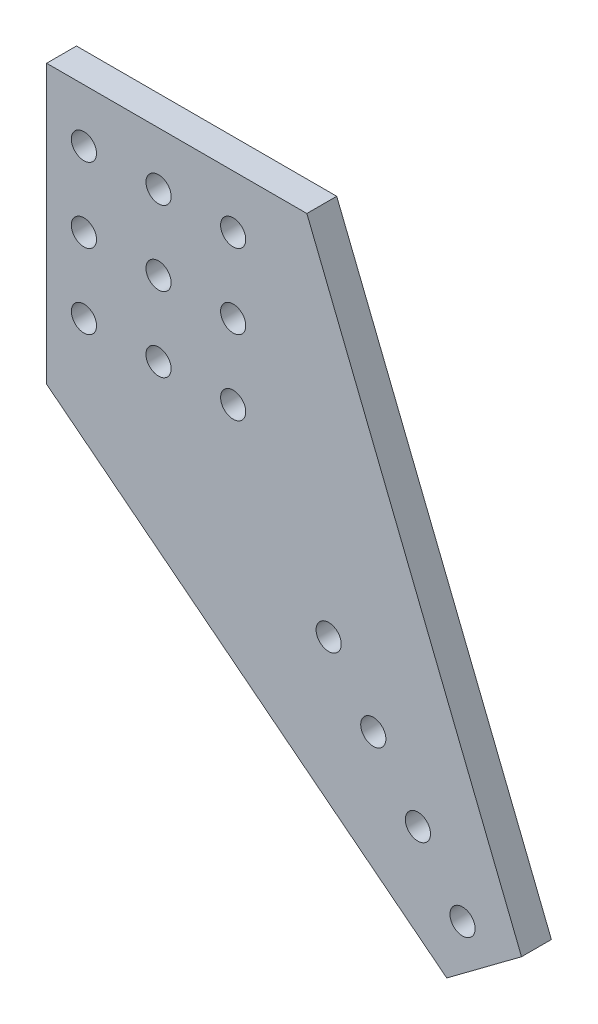
ISO-10303-21;
HEADER;
FILE_DESCRIPTION(('STEP AP214'),'2;1');
FILE_NAME('part.step','',(''),(''),'','','');
FILE_SCHEMA(('AUTOMOTIVE_DESIGN { 1 0 10303 214 1 1 1 1 }'));
ENDSEC;
DATA;
#1=APPLICATION_CONTEXT('core data for automotive mechanical design processes');
#2=APPLICATION_PROTOCOL_DEFINITION('international standard','automotive_design',2000,#1);
#3=PRODUCT_CONTEXT('',#1,'mechanical');
#4=PRODUCT('Part','Part','',(#3));
#5=PRODUCT_RELATED_PRODUCT_CATEGORY('part','',(#4));
#6=PRODUCT_DEFINITION_FORMATION('','',#4);
#7=PRODUCT_DEFINITION_CONTEXT('part definition',#1,'design');
#8=PRODUCT_DEFINITION('design','',#6,#7);
#9=PRODUCT_DEFINITION_SHAPE('','',#8);
#10=(LENGTH_UNIT() NAMED_UNIT(*) SI_UNIT(.MILLI.,.METRE.));
#11=(NAMED_UNIT(*) PLANE_ANGLE_UNIT() SI_UNIT($,.RADIAN.));
#12=(NAMED_UNIT(*) SI_UNIT($,.STERADIAN.) SOLID_ANGLE_UNIT());
#13=UNCERTAINTY_MEASURE_WITH_UNIT(LENGTH_MEASURE(1.E-05),#10,'distance_accuracy_value','');
#14=(GEOMETRIC_REPRESENTATION_CONTEXT(3) GLOBAL_UNCERTAINTY_ASSIGNED_CONTEXT((#13)) GLOBAL_UNIT_ASSIGNED_CONTEXT((#10,
#11,#12)) REPRESENTATION_CONTEXT('',''));
#15=CARTESIAN_POINT('',(0.,0.,0.));
#16=DIRECTION('',(0.,0.,1.));
#17=DIRECTION('',(1.,0.,0.));
#18=AXIS2_PLACEMENT_3D('',#15,#16,#17);
#19=CARTESIAN_POINT('',(0.,0.,-32.));
#20=DIRECTION('',(0.,0.,1.));
#21=DIRECTION('',(1.,0.,0.));
#22=AXIS2_PLACEMENT_3D('',#19,#20,#21);
#23=PLANE('',#22);
#24=CARTESIAN_POINT('',(0.,-80.,-32.));
#25=DIRECTION('',(0.,0.,-1.));
#26=DIRECTION('',(-1.,0.,0.));
#27=AXIS2_PLACEMENT_3D('',#24,#25,#26);
#28=CIRCLE('',#27,13.5);
#29=CARTESIAN_POINT('',(-13.5,-80.,-32.));
#30=VERTEX_POINT('',#29);
#31=EDGE_CURVE('E208',#30,#30,#28,.T.);
#32=ORIENTED_EDGE('',*,*,#31,.F.);
#33=EDGE_LOOP('',(#32));
#34=FACE_BOUND('',#33,.T.);
#35=CARTESIAN_POINT('',(80.,80.,-32.));
#36=DIRECTION('',(0.,0.,-1.));
#37=DIRECTION('',(-1.,0.,0.));
#38=AXIS2_PLACEMENT_3D('',#35,#36,#37);
#39=CIRCLE('',#38,13.5);
#40=CARTESIAN_POINT('',(66.5,80.,-32.));
#41=VERTEX_POINT('',#40);
#42=EDGE_CURVE('E220',#41,#41,#39,.T.);
#43=ORIENTED_EDGE('',*,*,#42,.F.);
#44=EDGE_LOOP('',(#43));
#45=FACE_BOUND('',#44,.T.);
#46=CARTESIAN_POINT('',(-80.,80.,-32.));
#47=DIRECTION('',(0.,0.,-1.));
#48=DIRECTION('',(-1.,0.,0.));
#49=AXIS2_PLACEMENT_3D('',#46,#47,#48);
#50=CIRCLE('',#49,13.5);
#51=CARTESIAN_POINT('',(-93.5,80.,-32.));
#52=VERTEX_POINT('',#51);
#53=EDGE_CURVE('E232',#52,#52,#50,.T.);
#54=ORIENTED_EDGE('',*,*,#53,.F.);
#55=EDGE_LOOP('',(#54));
#56=FACE_BOUND('',#55,.T.);
#57=CARTESIAN_POINT('',(-80.,0.,-32.));
#58=DIRECTION('',(0.,0.,-1.));
#59=DIRECTION('',(-1.,0.,0.));
#60=AXIS2_PLACEMENT_3D('',#57,#58,#59);
#61=CIRCLE('',#60,13.5);
#62=CARTESIAN_POINT('',(-93.5,0.,-32.));
#63=VERTEX_POINT('',#62);
#64=EDGE_CURVE('E244',#63,#63,#61,.T.);
#65=ORIENTED_EDGE('',*,*,#64,.F.);
#66=EDGE_LOOP('',(#65));
#67=FACE_BOUND('',#66,.T.);
#68=CARTESIAN_POINT('',(278.044933423364,-372.714387966976,-32.));
#69=DIRECTION('',(0.,0.,-1.));
#70=DIRECTION('',(-1.,0.,0.));
#71=AXIS2_PLACEMENT_3D('',#68,#69,#70);
#72=CIRCLE('',#71,13.5);
#73=CARTESIAN_POINT('',(264.544933423364,-372.714387966976,-32.));
#74=VERTEX_POINT('',#73);
#75=EDGE_CURVE('E256',#74,#74,#72,.T.);
#76=ORIENTED_EDGE('',*,*,#75,.F.);
#77=EDGE_LOOP('',(#76));
#78=FACE_BOUND('',#77,.T.);
#79=CARTESIAN_POINT('',(182.373558481991,-244.468577053608,-32.));
#80=DIRECTION('',(0.,0.,-1.));
#81=DIRECTION('',(-1.,0.,0.));
#82=AXIS2_PLACEMENT_3D('',#79,#80,#81);
#83=CIRCLE('',#82,13.5);
#84=CARTESIAN_POINT('',(168.873558481991,-244.468577053608,-32.));
#85=VERTEX_POINT('',#84);
#86=EDGE_CURVE('E268',#85,#85,#83,.T.);
#87=ORIENTED_EDGE('',*,*,#86,.F.);
#88=EDGE_LOOP('',(#87));
#89=FACE_BOUND('',#88,.T.);
#90=DIRECTION('',(-0.786547065545626,0.617530334219757,0.));
#91=VECTOR('',#90,1.);
#92=CARTESIAN_POINT('',(-120.,-161.,-32.));
#93=LINE('',#92,#91);
#94=CARTESIAN_POINT('',(308.97457337278,-497.794609338358,-32.));
#95=VERTEX_POINT('',#94);
#96=CARTESIAN_POINT('',(-120.,-161.,-32.));
#97=VERTEX_POINT('',#96);
#98=EDGE_CURVE('E116',#95,#97,#93,.T.);
#99=ORIENTED_EDGE('',*,*,#98,.T.);
#100=DIRECTION('',(0.,1.,0.));
#101=VECTOR('',#100,1.);
#102=CARTESIAN_POINT('',(-120.,-161.,-32.));
#103=LINE('',#102,#101);
#104=CARTESIAN_POINT('',(-120.,137.,-32.));
#105=VERTEX_POINT('',#104);
#106=EDGE_CURVE('E83',#97,#105,#103,.T.);
#107=ORIENTED_EDGE('',*,*,#106,.T.);
#108=DIRECTION('',(1.,0.,0.));
#109=VECTOR('',#108,1.);
#110=CARTESIAN_POINT('',(-120.,137.,-32.));
#111=LINE('',#110,#109);
#112=CARTESIAN_POINT('',(159.,137.,-32.));
#113=VERTEX_POINT('',#112);
#114=EDGE_CURVE('E87',#105,#113,#111,.T.);
#115=ORIENTED_EDGE('',*,*,#114,.T.);
#116=DIRECTION('',(0.371569119840066,-0.928405293598264,0.));
#117=VECTOR('',#116,1.);
#118=CARTESIAN_POINT('',(159.,137.,-32.));
#119=LINE('',#118,#117);
#120=CARTESIAN_POINT('',(389.128205193635,-438.,-32.));
#121=VERTEX_POINT('',#120);
#122=EDGE_CURVE('E91',#113,#121,#119,.T.);
#123=ORIENTED_EDGE('',*,*,#122,.T.);
#124=DIRECTION('',(-0.80153631820855,-0.597946093383577,0.));
#125=VECTOR('',#124,1.);
#126=CARTESIAN_POINT('',(308.97457337278,-497.794609338358,-32.));
#127=LINE('',#126,#125);
#128=EDGE_CURVE('E49',#121,#95,#127,.T.);
#129=ORIENTED_EDGE('',*,*,#128,.T.);
#130=EDGE_LOOP('',(#99,#107,#115,#123,#129));
#131=FACE_BOUND('',#130,.T.);
#132=CARTESIAN_POINT('',(0.,0.,-32.));
#133=DIRECTION('',(0.,0.,-1.));
#134=DIRECTION('',(-1.,0.,0.));
#135=AXIS2_PLACEMENT_3D('',#132,#133,#134);
#136=CIRCLE('',#135,13.5);
#137=CARTESIAN_POINT('',(-13.5,0.,-32.));
#138=VERTEX_POINT('',#137);
#139=EDGE_CURVE('E111',#138,#138,#136,.T.);
#140=ORIENTED_EDGE('',*,*,#139,.F.);
#141=EDGE_LOOP('',(#140));
#142=FACE_BOUND('',#141,.T.);
#143=CARTESIAN_POINT('',(230.209245952678,-308.591482510292,-32.));
#144=DIRECTION('',(0.,0.,-1.));
#145=DIRECTION('',(-1.,0.,0.));
#146=AXIS2_PLACEMENT_3D('',#143,#144,#145);
#147=CIRCLE('',#146,13.5);
#148=CARTESIAN_POINT('',(216.709245952678,-308.591482510292,-32.));
#149=VERTEX_POINT('',#148);
#150=EDGE_CURVE('E262',#149,#149,#147,.T.);
#151=ORIENTED_EDGE('',*,*,#150,.F.);
#152=EDGE_LOOP('',(#151));
#153=FACE_BOUND('',#152,.T.);
#154=CARTESIAN_POINT('',(325.88062089405,-436.83729342366,-32.));
#155=DIRECTION('',(0.,0.,-1.));
#156=DIRECTION('',(-1.,0.,0.));
#157=AXIS2_PLACEMENT_3D('',#154,#155,#156);
#158=CIRCLE('',#157,13.5);
#159=CARTESIAN_POINT('',(312.38062089405,-436.83729342366,-32.));
#160=VERTEX_POINT('',#159);
#161=EDGE_CURVE('E250',#160,#160,#158,.T.);
#162=ORIENTED_EDGE('',*,*,#161,.F.);
#163=EDGE_LOOP('',(#162));
#164=FACE_BOUND('',#163,.T.);
#165=CARTESIAN_POINT('',(80.,0.,-32.));
#166=DIRECTION('',(0.,0.,-1.));
#167=DIRECTION('',(-1.,0.,0.));
#168=AXIS2_PLACEMENT_3D('',#165,#166,#167);
#169=CIRCLE('',#168,13.5);
#170=CARTESIAN_POINT('',(66.5,0.,-32.));
#171=VERTEX_POINT('',#170);
#172=EDGE_CURVE('E238',#171,#171,#169,.T.);
#173=ORIENTED_EDGE('',*,*,#172,.F.);
#174=EDGE_LOOP('',(#173));
#175=FACE_BOUND('',#174,.T.);
#176=CARTESIAN_POINT('',(0.,80.,-32.));
#177=DIRECTION('',(0.,0.,-1.));
#178=DIRECTION('',(-1.,0.,0.));
#179=AXIS2_PLACEMENT_3D('',#176,#177,#178);
#180=CIRCLE('',#179,13.5);
#181=CARTESIAN_POINT('',(-13.5,80.,-32.));
#182=VERTEX_POINT('',#181);
#183=EDGE_CURVE('E226',#182,#182,#180,.T.);
#184=ORIENTED_EDGE('',*,*,#183,.F.);
#185=EDGE_LOOP('',(#184));
#186=FACE_BOUND('',#185,.T.);
#187=CARTESIAN_POINT('',(-80.,-80.,-32.));
#188=DIRECTION('',(0.,0.,-1.));
#189=DIRECTION('',(-1.,0.,0.));
#190=AXIS2_PLACEMENT_3D('',#187,#188,#189);
#191=CIRCLE('',#190,13.5);
#192=CARTESIAN_POINT('',(-93.5,-80.,-32.));
#193=VERTEX_POINT('',#192);
#194=EDGE_CURVE('E214',#193,#193,#191,.T.);
#195=ORIENTED_EDGE('',*,*,#194,.F.);
#196=EDGE_LOOP('',(#195));
#197=FACE_BOUND('',#196,.T.);
#198=CARTESIAN_POINT('',(80.,-80.,-32.));
#199=DIRECTION('',(0.,0.,-1.));
#200=DIRECTION('',(-1.,0.,0.));
#201=AXIS2_PLACEMENT_3D('',#198,#199,#200);
#202=CIRCLE('',#201,13.5);
#203=CARTESIAN_POINT('',(66.5,-80.,-32.));
#204=VERTEX_POINT('',#203);
#205=EDGE_CURVE('E199',#204,#204,#202,.T.);
#206=ORIENTED_EDGE('',*,*,#205,.F.);
#207=EDGE_LOOP('',(#206));
#208=FACE_BOUND('',#207,.T.);
#209=ADVANCED_FACE('F32',(#34,#45,#56,#67,#78,#89,#131,#142,#153,#164,#175,#186,#197,#208),#23,.F.);
#210=CARTESIAN_POINT('',(0.,0.,0.));
#211=DIRECTION('',(0.,0.,1.));
#212=DIRECTION('',(1.,0.,0.));
#213=AXIS2_PLACEMENT_3D('',#210,#211,#212);
#214=PLANE('',#213);
#215=CARTESIAN_POINT('',(0.,-80.,0.));
#216=DIRECTION('',(0.,0.,-1.));
#217=DIRECTION('',(-1.,0.,0.));
#218=AXIS2_PLACEMENT_3D('',#215,#216,#217);
#219=CIRCLE('',#218,13.5);
#220=CARTESIAN_POINT('',(-13.5,-80.,0.));
#221=VERTEX_POINT('',#220);
#222=EDGE_CURVE('E205',#221,#221,#219,.T.);
#223=ORIENTED_EDGE('',*,*,#222,.T.);
#224=EDGE_LOOP('',(#223));
#225=FACE_BOUND('',#224,.T.);
#226=CARTESIAN_POINT('',(80.,80.,0.));
#227=DIRECTION('',(0.,0.,-1.));
#228=DIRECTION('',(-1.,0.,0.));
#229=AXIS2_PLACEMENT_3D('',#226,#227,#228);
#230=CIRCLE('',#229,13.5);
#231=CARTESIAN_POINT('',(66.5,80.,0.));
#232=VERTEX_POINT('',#231);
#233=EDGE_CURVE('E217',#232,#232,#230,.T.);
#234=ORIENTED_EDGE('',*,*,#233,.T.);
#235=EDGE_LOOP('',(#234));
#236=FACE_BOUND('',#235,.T.);
#237=CARTESIAN_POINT('',(-80.,80.,0.));
#238=DIRECTION('',(0.,0.,-1.));
#239=DIRECTION('',(-1.,0.,0.));
#240=AXIS2_PLACEMENT_3D('',#237,#238,#239);
#241=CIRCLE('',#240,13.5);
#242=CARTESIAN_POINT('',(-93.5,80.,0.));
#243=VERTEX_POINT('',#242);
#244=EDGE_CURVE('E229',#243,#243,#241,.T.);
#245=ORIENTED_EDGE('',*,*,#244,.T.);
#246=EDGE_LOOP('',(#245));
#247=FACE_BOUND('',#246,.T.);
#248=CARTESIAN_POINT('',(-80.,0.,0.));
#249=DIRECTION('',(0.,0.,-1.));
#250=DIRECTION('',(-1.,0.,0.));
#251=AXIS2_PLACEMENT_3D('',#248,#249,#250);
#252=CIRCLE('',#251,13.5);
#253=CARTESIAN_POINT('',(-93.5,0.,0.));
#254=VERTEX_POINT('',#253);
#255=EDGE_CURVE('E241',#254,#254,#252,.T.);
#256=ORIENTED_EDGE('',*,*,#255,.T.);
#257=EDGE_LOOP('',(#256));
#258=FACE_BOUND('',#257,.T.);
#259=CARTESIAN_POINT('',(278.044933423364,-372.714387966976,0.));
#260=DIRECTION('',(0.,0.,-1.));
#261=DIRECTION('',(-1.,0.,0.));
#262=AXIS2_PLACEMENT_3D('',#259,#260,#261);
#263=CIRCLE('',#262,13.5);
#264=CARTESIAN_POINT('',(264.544933423364,-372.714387966976,0.));
#265=VERTEX_POINT('',#264);
#266=EDGE_CURVE('E253',#265,#265,#263,.T.);
#267=ORIENTED_EDGE('',*,*,#266,.T.);
#268=EDGE_LOOP('',(#267));
#269=FACE_BOUND('',#268,.T.);
#270=CARTESIAN_POINT('',(182.373558481991,-244.468577053608,0.));
#271=DIRECTION('',(0.,0.,-1.));
#272=DIRECTION('',(-1.,0.,0.));
#273=AXIS2_PLACEMENT_3D('',#270,#271,#272);
#274=CIRCLE('',#273,13.5);
#275=CARTESIAN_POINT('',(168.873558481991,-244.468577053608,0.));
#276=VERTEX_POINT('',#275);
#277=EDGE_CURVE('E265',#276,#276,#274,.T.);
#278=ORIENTED_EDGE('',*,*,#277,.T.);
#279=EDGE_LOOP('',(#278));
#280=FACE_BOUND('',#279,.T.);
#281=DIRECTION('',(-0.786547065545626,0.617530334219757,0.));
#282=VECTOR('',#281,1.);
#283=CARTESIAN_POINT('',(-120.,-161.,0.));
#284=LINE('',#283,#282);
#285=CARTESIAN_POINT('',(308.97457337278,-497.794609338358,0.));
#286=VERTEX_POINT('',#285);
#287=CARTESIAN_POINT('',(-120.,-161.,0.));
#288=VERTEX_POINT('',#287);
#289=EDGE_CURVE('E107',#286,#288,#284,.T.);
#290=ORIENTED_EDGE('',*,*,#289,.F.);
#291=DIRECTION('',(-0.80153631820855,-0.597946093383577,0.));
#292=VECTOR('',#291,1.);
#293=CARTESIAN_POINT('',(308.97457337278,-497.794609338358,0.));
#294=LINE('',#293,#292);
#295=CARTESIAN_POINT('',(389.128205193635,-438.,0.));
#296=VERTEX_POINT('',#295);
#297=EDGE_CURVE('E75',#296,#286,#294,.T.);
#298=ORIENTED_EDGE('',*,*,#297,.F.);
#299=DIRECTION('',(0.371569119840066,-0.928405293598264,0.));
#300=VECTOR('',#299,1.);
#301=CARTESIAN_POINT('',(159.,137.,0.));
#302=LINE('',#301,#300);
#303=CARTESIAN_POINT('',(159.,137.,0.));
#304=VERTEX_POINT('',#303);
#305=EDGE_CURVE('E69',#304,#296,#302,.T.);
#306=ORIENTED_EDGE('',*,*,#305,.F.);
#307=DIRECTION('',(1.,0.,0.));
#308=VECTOR('',#307,1.);
#309=CARTESIAN_POINT('',(-120.,137.,0.));
#310=LINE('',#309,#308);
#311=CARTESIAN_POINT('',(-120.,137.,0.));
#312=VERTEX_POINT('',#311);
#313=EDGE_CURVE('E98',#312,#304,#310,.T.);
#314=ORIENTED_EDGE('',*,*,#313,.F.);
#315=DIRECTION('',(0.,1.,0.));
#316=VECTOR('',#315,1.);
#317=CARTESIAN_POINT('',(-120.,-161.,0.));
#318=LINE('',#317,#316);
#319=EDGE_CURVE('E110',#288,#312,#318,.T.);
#320=ORIENTED_EDGE('',*,*,#319,.F.);
#321=EDGE_LOOP('',(#290,#298,#306,#314,#320));
#322=FACE_BOUND('',#321,.T.);
#323=CARTESIAN_POINT('',(0.,0.,0.));
#324=DIRECTION('',(0.,0.,-1.));
#325=DIRECTION('',(-1.,0.,0.));
#326=AXIS2_PLACEMENT_3D('',#323,#324,#325);
#327=CIRCLE('',#326,13.5);
#328=CARTESIAN_POINT('',(-13.5,0.,0.));
#329=VERTEX_POINT('',#328);
#330=EDGE_CURVE('E271',#329,#329,#327,.T.);
#331=ORIENTED_EDGE('',*,*,#330,.T.);
#332=EDGE_LOOP('',(#331));
#333=FACE_BOUND('',#332,.T.);
#334=CARTESIAN_POINT('',(230.209245952678,-308.591482510292,0.));
#335=DIRECTION('',(0.,0.,-1.));
#336=DIRECTION('',(-1.,0.,0.));
#337=AXIS2_PLACEMENT_3D('',#334,#335,#336);
#338=CIRCLE('',#337,13.5);
#339=CARTESIAN_POINT('',(216.709245952678,-308.591482510292,0.));
#340=VERTEX_POINT('',#339);
#341=EDGE_CURVE('E259',#340,#340,#338,.T.);
#342=ORIENTED_EDGE('',*,*,#341,.T.);
#343=EDGE_LOOP('',(#342));
#344=FACE_BOUND('',#343,.T.);
#345=CARTESIAN_POINT('',(325.88062089405,-436.83729342366,0.));
#346=DIRECTION('',(0.,0.,-1.));
#347=DIRECTION('',(-1.,0.,0.));
#348=AXIS2_PLACEMENT_3D('',#345,#346,#347);
#349=CIRCLE('',#348,13.5);
#350=CARTESIAN_POINT('',(312.38062089405,-436.83729342366,0.));
#351=VERTEX_POINT('',#350);
#352=EDGE_CURVE('E247',#351,#351,#349,.T.);
#353=ORIENTED_EDGE('',*,*,#352,.T.);
#354=EDGE_LOOP('',(#353));
#355=FACE_BOUND('',#354,.T.);
#356=CARTESIAN_POINT('',(80.,0.,0.));
#357=DIRECTION('',(0.,0.,-1.));
#358=DIRECTION('',(-1.,0.,0.));
#359=AXIS2_PLACEMENT_3D('',#356,#357,#358);
#360=CIRCLE('',#359,13.5);
#361=CARTESIAN_POINT('',(66.5,0.,0.));
#362=VERTEX_POINT('',#361);
#363=EDGE_CURVE('E235',#362,#362,#360,.T.);
#364=ORIENTED_EDGE('',*,*,#363,.T.);
#365=EDGE_LOOP('',(#364));
#366=FACE_BOUND('',#365,.T.);
#367=CARTESIAN_POINT('',(0.,80.,0.));
#368=DIRECTION('',(0.,0.,-1.));
#369=DIRECTION('',(-1.,0.,0.));
#370=AXIS2_PLACEMENT_3D('',#367,#368,#369);
#371=CIRCLE('',#370,13.5);
#372=CARTESIAN_POINT('',(-13.5,80.,0.));
#373=VERTEX_POINT('',#372);
#374=EDGE_CURVE('E223',#373,#373,#371,.T.);
#375=ORIENTED_EDGE('',*,*,#374,.T.);
#376=EDGE_LOOP('',(#375));
#377=FACE_BOUND('',#376,.T.);
#378=CARTESIAN_POINT('',(-80.,-80.,0.));
#379=DIRECTION('',(0.,0.,-1.));
#380=DIRECTION('',(-1.,0.,0.));
#381=AXIS2_PLACEMENT_3D('',#378,#379,#380);
#382=CIRCLE('',#381,13.5);
#383=CARTESIAN_POINT('',(-93.5,-80.,0.));
#384=VERTEX_POINT('',#383);
#385=EDGE_CURVE('E211',#384,#384,#382,.T.);
#386=ORIENTED_EDGE('',*,*,#385,.T.);
#387=EDGE_LOOP('',(#386));
#388=FACE_BOUND('',#387,.T.);
#389=CARTESIAN_POINT('',(80.,-80.,0.));
#390=DIRECTION('',(0.,0.,-1.));
#391=DIRECTION('',(-1.,0.,0.));
#392=AXIS2_PLACEMENT_3D('',#389,#390,#391);
#393=CIRCLE('',#392,13.5);
#394=CARTESIAN_POINT('',(66.5,-80.,0.));
#395=VERTEX_POINT('',#394);
#396=EDGE_CURVE('E202',#395,#395,#393,.T.);
#397=ORIENTED_EDGE('',*,*,#396,.T.);
#398=EDGE_LOOP('',(#397));
#399=FACE_BOUND('',#398,.T.);
#400=ADVANCED_FACE('F120',(#225,#236,#247,#258,#269,#280,#322,#333,#344,#355,#366,#377,#388,
#399),#214,.T.);
#401=CARTESIAN_POINT('',(-120.,-161.,-32.));
#402=DIRECTION('',(0.617530334219757,0.786547065545626,0.));
#403=DIRECTION('',(-0.786547065545626,0.617530334219757,0.));
#404=AXIS2_PLACEMENT_3D('',#401,#402,#403);
#405=PLANE('',#404);
#406=ORIENTED_EDGE('',*,*,#289,.T.);
#407=DIRECTION('',(0.,0.,1.));
#408=VECTOR('',#407,1.);
#409=CARTESIAN_POINT('',(-120.,-161.,-32.));
#410=LINE('',#409,#408);
#411=EDGE_CURVE('E11',#97,#288,#410,.T.);
#412=ORIENTED_EDGE('',*,*,#411,.F.);
#413=ORIENTED_EDGE('',*,*,#98,.F.);
#414=DIRECTION('',(0.,0.,1.));
#415=VECTOR('',#414,1.);
#416=CARTESIAN_POINT('',(308.97457337278,-497.794609338358,-32.));
#417=LINE('',#416,#415);
#418=EDGE_CURVE('E103',#95,#286,#417,.T.);
#419=ORIENTED_EDGE('',*,*,#418,.T.);
#420=EDGE_LOOP('',(#406,#412,#413,#419));
#421=FACE_BOUND('',#420,.T.);
#422=ADVANCED_FACE('F34',(#421),#405,.F.);
#423=CARTESIAN_POINT('',(-120.,-161.,-32.));
#424=DIRECTION('',(1.,0.,0.));
#425=DIRECTION('',(0.,1.,0.));
#426=AXIS2_PLACEMENT_3D('',#423,#424,#425);
#427=PLANE('',#426);
#428=ORIENTED_EDGE('',*,*,#319,.T.);
#429=DIRECTION('',(0.,0.,1.));
#430=VECTOR('',#429,1.);
#431=CARTESIAN_POINT('',(-120.,137.,-32.));
#432=LINE('',#431,#430);
#433=EDGE_CURVE('E41',#105,#312,#432,.T.);
#434=ORIENTED_EDGE('',*,*,#433,.F.);
#435=ORIENTED_EDGE('',*,*,#106,.F.);
#436=ORIENTED_EDGE('',*,*,#411,.T.);
#437=EDGE_LOOP('',(#428,#434,#435,#436));
#438=FACE_BOUND('',#437,.T.);
#439=ADVANCED_FACE('F400',(#438),#427,.F.);
#440=CARTESIAN_POINT('',(-120.,137.,-32.));
#441=DIRECTION('',(0.,-1.,0.));
#442=DIRECTION('',(0.,0.,-1.));
#443=AXIS2_PLACEMENT_3D('',#440,#441,#442);
#444=PLANE('',#443);
#445=ORIENTED_EDGE('',*,*,#313,.T.);
#446=DIRECTION('',(0.,0.,1.));
#447=VECTOR('',#446,1.);
#448=CARTESIAN_POINT('',(159.,137.,-32.));
#449=LINE('',#448,#447);
#450=EDGE_CURVE('E95',#113,#304,#449,.T.);
#451=ORIENTED_EDGE('',*,*,#450,.F.);
#452=ORIENTED_EDGE('',*,*,#114,.F.);
#453=ORIENTED_EDGE('',*,*,#433,.T.);
#454=EDGE_LOOP('',(#445,#451,#452,#453));
#455=FACE_BOUND('',#454,.T.);
#456=ADVANCED_FACE('F96',(#455),#444,.F.);
#457=CARTESIAN_POINT('',(159.,137.,-32.));
#458=DIRECTION('',(-0.928405293598264,-0.371569119840066,0.));
#459=DIRECTION('',(0.371569119840066,-0.928405293598264,0.));
#460=AXIS2_PLACEMENT_3D('',#457,#458,#459);
#461=PLANE('',#460);
#462=ORIENTED_EDGE('',*,*,#305,.T.);
#463=DIRECTION('',(0.,0.,1.));
#464=VECTOR('',#463,1.);
#465=CARTESIAN_POINT('',(389.128205193635,-438.,-32.));
#466=LINE('',#465,#464);
#467=EDGE_CURVE('E99',#121,#296,#466,.T.);
#468=ORIENTED_EDGE('',*,*,#467,.F.);
#469=ORIENTED_EDGE('',*,*,#122,.F.);
#470=ORIENTED_EDGE('',*,*,#450,.T.);
#471=EDGE_LOOP('',(#462,#468,#469,#470));
#472=FACE_BOUND('',#471,.T.);
#473=ADVANCED_FACE('F101',(#472),#461,.F.);
#474=CARTESIAN_POINT('',(308.97457337278,-497.794609338358,-32.));
#475=DIRECTION('',(-0.597946093383577,0.801536318208551,0.));
#476=DIRECTION('',(-0.801536318208551,-0.597946093383577,0.));
#477=AXIS2_PLACEMENT_3D('',#474,#475,#476);
#478=PLANE('',#477);
#479=ORIENTED_EDGE('',*,*,#297,.T.);
#480=ORIENTED_EDGE('',*,*,#418,.F.);
#481=ORIENTED_EDGE('',*,*,#128,.F.);
#482=ORIENTED_EDGE('',*,*,#467,.T.);
#483=EDGE_LOOP('',(#479,#480,#481,#482));
#484=FACE_BOUND('',#483,.T.);
#485=ADVANCED_FACE('F125',(#484),#478,.F.);
#486=CARTESIAN_POINT('',(0.,0.,-32.));
#487=DIRECTION('',(0.,0.,1.));
#488=DIRECTION('',(1.,0.,0.));
#489=AXIS2_PLACEMENT_3D('',#486,#487,#488);
#490=CYLINDRICAL_SURFACE('',#489,13.5);
#491=ORIENTED_EDGE('',*,*,#139,.T.);
#492=EDGE_LOOP('',(#491));
#493=FACE_BOUND('',#492,.T.);
#494=ORIENTED_EDGE('',*,*,#330,.F.);
#495=EDGE_LOOP('',(#494));
#496=FACE_BOUND('',#495,.T.);
#497=ADVANCED_FACE('F127',(#493,#496),#490,.F.);
#498=CARTESIAN_POINT('',(182.373558481991,-244.468577053608,-32.));
#499=DIRECTION('',(0.,0.,1.));
#500=DIRECTION('',(1.,0.,0.));
#501=AXIS2_PLACEMENT_3D('',#498,#499,#500);
#502=CYLINDRICAL_SURFACE('',#501,13.5);
#503=ORIENTED_EDGE('',*,*,#86,.T.);
#504=EDGE_LOOP('',(#503));
#505=FACE_BOUND('',#504,.T.);
#506=ORIENTED_EDGE('',*,*,#277,.F.);
#507=EDGE_LOOP('',(#506));
#508=FACE_BOUND('',#507,.T.);
#509=ADVANCED_FACE('F133',(#505,#508),#502,.F.);
#510=CARTESIAN_POINT('',(230.209245952678,-308.591482510292,-32.));
#511=DIRECTION('',(0.,0.,1.));
#512=DIRECTION('',(1.,0.,0.));
#513=AXIS2_PLACEMENT_3D('',#510,#511,#512);
#514=CYLINDRICAL_SURFACE('',#513,13.5);
#515=ORIENTED_EDGE('',*,*,#150,.T.);
#516=EDGE_LOOP('',(#515));
#517=FACE_BOUND('',#516,.T.);
#518=ORIENTED_EDGE('',*,*,#341,.F.);
#519=EDGE_LOOP('',(#518));
#520=FACE_BOUND('',#519,.T.);
#521=ADVANCED_FACE('F150',(#517,#520),#514,.F.);
#522=CARTESIAN_POINT('',(278.044933423364,-372.714387966976,-32.));
#523=DIRECTION('',(0.,0.,1.));
#524=DIRECTION('',(1.,0.,0.));
#525=AXIS2_PLACEMENT_3D('',#522,#523,#524);
#526=CYLINDRICAL_SURFACE('',#525,13.5);
#527=ORIENTED_EDGE('',*,*,#75,.T.);
#528=EDGE_LOOP('',(#527));
#529=FACE_BOUND('',#528,.T.);
#530=ORIENTED_EDGE('',*,*,#266,.F.);
#531=EDGE_LOOP('',(#530));
#532=FACE_BOUND('',#531,.T.);
#533=ADVANCED_FACE('F154',(#529,#532),#526,.F.);
#534=CARTESIAN_POINT('',(325.88062089405,-436.83729342366,-32.));
#535=DIRECTION('',(0.,0.,1.));
#536=DIRECTION('',(1.,0.,0.));
#537=AXIS2_PLACEMENT_3D('',#534,#535,#536);
#538=CYLINDRICAL_SURFACE('',#537,13.5);
#539=ORIENTED_EDGE('',*,*,#161,.T.);
#540=EDGE_LOOP('',(#539));
#541=FACE_BOUND('',#540,.T.);
#542=ORIENTED_EDGE('',*,*,#352,.F.);
#543=EDGE_LOOP('',(#542));
#544=FACE_BOUND('',#543,.T.);
#545=ADVANCED_FACE('F158',(#541,#544),#538,.F.);
#546=CARTESIAN_POINT('',(-80.,0.,-32.));
#547=DIRECTION('',(0.,0.,1.));
#548=DIRECTION('',(1.,0.,0.));
#549=AXIS2_PLACEMENT_3D('',#546,#547,#548);
#550=CYLINDRICAL_SURFACE('',#549,13.5);
#551=ORIENTED_EDGE('',*,*,#64,.T.);
#552=EDGE_LOOP('',(#551));
#553=FACE_BOUND('',#552,.T.);
#554=ORIENTED_EDGE('',*,*,#255,.F.);
#555=EDGE_LOOP('',(#554));
#556=FACE_BOUND('',#555,.T.);
#557=ADVANCED_FACE('F162',(#553,#556),#550,.F.);
#558=CARTESIAN_POINT('',(80.,0.,-32.));
#559=DIRECTION('',(0.,0.,1.));
#560=DIRECTION('',(1.,0.,0.));
#561=AXIS2_PLACEMENT_3D('',#558,#559,#560);
#562=CYLINDRICAL_SURFACE('',#561,13.5);
#563=ORIENTED_EDGE('',*,*,#172,.T.);
#564=EDGE_LOOP('',(#563));
#565=FACE_BOUND('',#564,.T.);
#566=ORIENTED_EDGE('',*,*,#363,.F.);
#567=EDGE_LOOP('',(#566));
#568=FACE_BOUND('',#567,.T.);
#569=ADVANCED_FACE('F166',(#565,#568),#562,.F.);
#570=CARTESIAN_POINT('',(-80.,80.,-32.));
#571=DIRECTION('',(0.,0.,1.));
#572=DIRECTION('',(1.,0.,0.));
#573=AXIS2_PLACEMENT_3D('',#570,#571,#572);
#574=CYLINDRICAL_SURFACE('',#573,13.5);
#575=ORIENTED_EDGE('',*,*,#53,.T.);
#576=EDGE_LOOP('',(#575));
#577=FACE_BOUND('',#576,.T.);
#578=ORIENTED_EDGE('',*,*,#244,.F.);
#579=EDGE_LOOP('',(#578));
#580=FACE_BOUND('',#579,.T.);
#581=ADVANCED_FACE('F170',(#577,#580),#574,.F.);
#582=CARTESIAN_POINT('',(0.,80.,-32.));
#583=DIRECTION('',(0.,0.,1.));
#584=DIRECTION('',(1.,0.,0.));
#585=AXIS2_PLACEMENT_3D('',#582,#583,#584);
#586=CYLINDRICAL_SURFACE('',#585,13.5);
#587=ORIENTED_EDGE('',*,*,#183,.T.);
#588=EDGE_LOOP('',(#587));
#589=FACE_BOUND('',#588,.T.);
#590=ORIENTED_EDGE('',*,*,#374,.F.);
#591=EDGE_LOOP('',(#590));
#592=FACE_BOUND('',#591,.T.);
#593=ADVANCED_FACE('F174',(#589,#592),#586,.F.);
#594=CARTESIAN_POINT('',(80.,80.,-32.));
#595=DIRECTION('',(0.,0.,1.));
#596=DIRECTION('',(1.,0.,0.));
#597=AXIS2_PLACEMENT_3D('',#594,#595,#596);
#598=CYLINDRICAL_SURFACE('',#597,13.5);
#599=ORIENTED_EDGE('',*,*,#42,.T.);
#600=EDGE_LOOP('',(#599));
#601=FACE_BOUND('',#600,.T.);
#602=ORIENTED_EDGE('',*,*,#233,.F.);
#603=EDGE_LOOP('',(#602));
#604=FACE_BOUND('',#603,.T.);
#605=ADVANCED_FACE('F178',(#601,#604),#598,.F.);
#606=CARTESIAN_POINT('',(-80.,-80.,-32.));
#607=DIRECTION('',(0.,0.,1.));
#608=DIRECTION('',(1.,0.,0.));
#609=AXIS2_PLACEMENT_3D('',#606,#607,#608);
#610=CYLINDRICAL_SURFACE('',#609,13.5);
#611=ORIENTED_EDGE('',*,*,#194,.T.);
#612=EDGE_LOOP('',(#611));
#613=FACE_BOUND('',#612,.T.);
#614=ORIENTED_EDGE('',*,*,#385,.F.);
#615=EDGE_LOOP('',(#614));
#616=FACE_BOUND('',#615,.T.);
#617=ADVANCED_FACE('F182',(#613,#616),#610,.F.);
#618=CARTESIAN_POINT('',(0.,-80.,-32.));
#619=DIRECTION('',(0.,0.,1.));
#620=DIRECTION('',(1.,0.,0.));
#621=AXIS2_PLACEMENT_3D('',#618,#619,#620);
#622=CYLINDRICAL_SURFACE('',#621,13.5);
#623=ORIENTED_EDGE('',*,*,#31,.T.);
#624=EDGE_LOOP('',(#623));
#625=FACE_BOUND('',#624,.T.);
#626=ORIENTED_EDGE('',*,*,#222,.F.);
#627=EDGE_LOOP('',(#626));
#628=FACE_BOUND('',#627,.T.);
#629=ADVANCED_FACE('F186',(#625,#628),#622,.F.);
#630=CARTESIAN_POINT('',(80.,-80.,-32.));
#631=DIRECTION('',(0.,0.,1.));
#632=DIRECTION('',(1.,0.,0.));
#633=AXIS2_PLACEMENT_3D('',#630,#631,#632);
#634=CYLINDRICAL_SURFACE('',#633,13.5);
#635=ORIENTED_EDGE('',*,*,#205,.T.);
#636=EDGE_LOOP('',(#635));
#637=FACE_BOUND('',#636,.T.);
#638=ORIENTED_EDGE('',*,*,#396,.F.);
#639=EDGE_LOOP('',(#638));
#640=FACE_BOUND('',#639,.T.);
#641=ADVANCED_FACE('F190',(#637,#640),#634,.F.);
#642=CLOSED_SHELL('',(#209,#400,#422,#439,#456,#473,#485,#497,#509,#521,#533,#545,#557,#569,
#581,#593,#605,#617,#629,#641));
#643=MANIFOLD_SOLID_BREP('B2',#642);
#644=ADVANCED_BREP_SHAPE_REPRESENTATION('',(#18,#643),#14);
#645=SHAPE_DEFINITION_REPRESENTATION(#9,#644);
ENDSEC;
END-ISO-10303-21;
